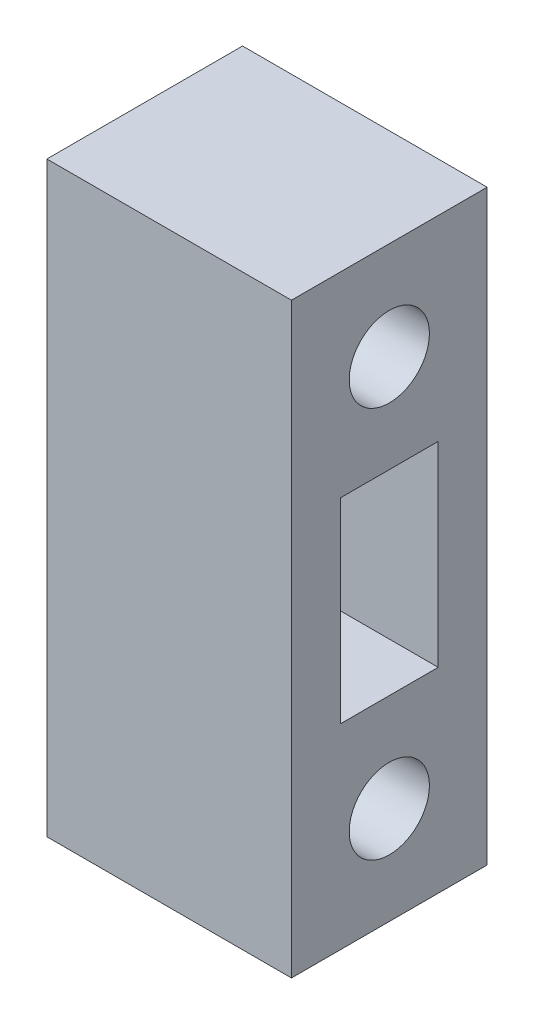
ISO-10303-21;
HEADER;
FILE_DESCRIPTION(('STEP AP214'),'2;1');
FILE_NAME('part.step','',(''),(''),'','','');
FILE_SCHEMA(('AUTOMOTIVE_DESIGN { 1 0 10303 214 1 1 1 1 }'));
ENDSEC;
DATA;
#1=APPLICATION_CONTEXT('core data for automotive mechanical design processes');
#2=APPLICATION_PROTOCOL_DEFINITION('international standard','automotive_design',2000,#1);
#3=PRODUCT_CONTEXT('',#1,'mechanical');
#4=PRODUCT('Part','Part','',(#3));
#5=PRODUCT_RELATED_PRODUCT_CATEGORY('part','',(#4));
#6=PRODUCT_DEFINITION_FORMATION('','',#4);
#7=PRODUCT_DEFINITION_CONTEXT('part definition',#1,'design');
#8=PRODUCT_DEFINITION('design','',#6,#7);
#9=PRODUCT_DEFINITION_SHAPE('','',#8);
#10=(LENGTH_UNIT() NAMED_UNIT(*) SI_UNIT(.MILLI.,.METRE.));
#11=(NAMED_UNIT(*) PLANE_ANGLE_UNIT() SI_UNIT($,.RADIAN.));
#12=(NAMED_UNIT(*) SI_UNIT($,.STERADIAN.) SOLID_ANGLE_UNIT());
#13=UNCERTAINTY_MEASURE_WITH_UNIT(LENGTH_MEASURE(1.E-05),#10,'distance_accuracy_value','');
#14=(GEOMETRIC_REPRESENTATION_CONTEXT(3) GLOBAL_UNCERTAINTY_ASSIGNED_CONTEXT((#13)) GLOBAL_UNIT_ASSIGNED_CONTEXT((#10,
#11,#12)) REPRESENTATION_CONTEXT('',''));
#15=CARTESIAN_POINT('',(0.,0.,0.));
#16=DIRECTION('',(0.,0.,1.));
#17=DIRECTION('',(1.,0.,0.));
#18=AXIS2_PLACEMENT_3D('',#15,#16,#17);
#19=CARTESIAN_POINT('',(25.,0.,0.));
#20=DIRECTION('',(-1.,0.,0.));
#21=DIRECTION('',(0.,0.,1.));
#22=AXIS2_PLACEMENT_3D('',#19,#20,#21);
#23=PLANE('',#22);
#24=CARTESIAN_POINT('',(25.,-20.,0.));
#25=DIRECTION('',(1.,0.,0.));
#26=DIRECTION('',(0.,0.,-1.));
#27=AXIS2_PLACEMENT_3D('',#24,#25,#26);
#28=CIRCLE('',#27,4.1);
#29=CARTESIAN_POINT('',(25.,-20.,-4.10000000000001));
#30=VERTEX_POINT('',#29);
#31=EDGE_CURVE('E134',#30,#30,#28,.T.);
#32=ORIENTED_EDGE('',*,*,#31,.F.);
#33=EDGE_LOOP('',(#32));
#34=FACE_BOUND('',#33,.T.);
#35=DIRECTION('',(0.,1.,0.));
#36=VECTOR('',#35,1.);
#37=CARTESIAN_POINT('',(25.,-30.,-10.));
#38=LINE('',#37,#36);
#39=CARTESIAN_POINT('',(25.,-30.,-10.));
#40=VERTEX_POINT('',#39);
#41=CARTESIAN_POINT('',(25.,30.,-10.));
#42=VERTEX_POINT('',#41);
#43=EDGE_CURVE('E146',#40,#42,#38,.T.);
#44=ORIENTED_EDGE('',*,*,#43,.T.);
#45=DIRECTION('',(0.,0.,1.));
#46=VECTOR('',#45,1.);
#47=CARTESIAN_POINT('',(25.,30.,10.));
#48=LINE('',#47,#46);
#49=CARTESIAN_POINT('',(25.,30.,10.));
#50=VERTEX_POINT('',#49);
#51=EDGE_CURVE('E149',#42,#50,#48,.T.);
#52=ORIENTED_EDGE('',*,*,#51,.T.);
#53=DIRECTION('',(0.,-1.,0.));
#54=VECTOR('',#53,1.);
#55=CARTESIAN_POINT('',(25.,-30.,10.));
#56=LINE('',#55,#54);
#57=CARTESIAN_POINT('',(25.,-30.,10.));
#58=VERTEX_POINT('',#57);
#59=EDGE_CURVE('E152',#50,#58,#56,.T.);
#60=ORIENTED_EDGE('',*,*,#59,.T.);
#61=DIRECTION('',(0.,0.,-1.));
#62=VECTOR('',#61,1.);
#63=CARTESIAN_POINT('',(25.,-30.,10.));
#64=LINE('',#63,#62);
#65=EDGE_CURVE('E154',#58,#40,#64,.T.);
#66=ORIENTED_EDGE('',*,*,#65,.T.);
#67=EDGE_LOOP('',(#44,#52,#60,#66));
#68=FACE_BOUND('',#67,.T.);
#69=CARTESIAN_POINT('',(25.,20.,0.));
#70=DIRECTION('',(1.,0.,0.));
#71=DIRECTION('',(0.,0.,-1.));
#72=AXIS2_PLACEMENT_3D('',#69,#70,#71);
#73=CIRCLE('',#72,4.1);
#74=CARTESIAN_POINT('',(25.,20.,-4.10000000000001));
#75=VERTEX_POINT('',#74);
#76=EDGE_CURVE('E140',#75,#75,#73,.T.);
#77=ORIENTED_EDGE('',*,*,#76,.F.);
#78=EDGE_LOOP('',(#77));
#79=FACE_BOUND('',#78,.T.);
#80=DIRECTION('',(0.,1.,0.));
#81=VECTOR('',#80,1.);
#82=CARTESIAN_POINT('',(25.,-10.,-5.));
#83=LINE('',#82,#81);
#84=CARTESIAN_POINT('',(25.,-10.,-5.));
#85=VERTEX_POINT('',#84);
#86=CARTESIAN_POINT('',(25.,10.,-5.));
#87=VERTEX_POINT('',#86);
#88=EDGE_CURVE('E98',#85,#87,#83,.T.);
#89=ORIENTED_EDGE('',*,*,#88,.F.);
#90=DIRECTION('',(0.,0.,-1.));
#91=VECTOR('',#90,1.);
#92=CARTESIAN_POINT('',(25.,-10.,5.));
#93=LINE('',#92,#91);
#94=CARTESIAN_POINT('',(25.,-10.,5.));
#95=VERTEX_POINT('',#94);
#96=EDGE_CURVE('E120',#95,#85,#93,.T.);
#97=ORIENTED_EDGE('',*,*,#96,.F.);
#98=DIRECTION('',(0.,-1.,0.));
#99=VECTOR('',#98,1.);
#100=CARTESIAN_POINT('',(25.,-10.,5.));
#101=LINE('',#100,#99);
#102=CARTESIAN_POINT('',(25.,10.,5.));
#103=VERTEX_POINT('',#102);
#104=EDGE_CURVE('E118',#103,#95,#101,.T.);
#105=ORIENTED_EDGE('',*,*,#104,.F.);
#106=DIRECTION('',(0.,0.,1.));
#107=VECTOR('',#106,1.);
#108=CARTESIAN_POINT('',(25.,10.,5.));
#109=LINE('',#108,#107);
#110=EDGE_CURVE('E106',#87,#103,#109,.T.);
#111=ORIENTED_EDGE('',*,*,#110,.F.);
#112=EDGE_LOOP('',(#89,#97,#105,#111));
#113=FACE_BOUND('',#112,.T.);
#114=ADVANCED_FACE('F33',(#34,#68,#79,#113),#23,.F.);
#115=CARTESIAN_POINT('',(0.,0.,0.));
#116=DIRECTION('',(-1.,0.,0.));
#117=DIRECTION('',(0.,0.,1.));
#118=AXIS2_PLACEMENT_3D('',#115,#116,#117);
#119=PLANE('',#118);
#120=CARTESIAN_POINT('',(0.,-20.,0.));
#121=DIRECTION('',(1.,0.,0.));
#122=DIRECTION('',(0.,0.,-1.));
#123=AXIS2_PLACEMENT_3D('',#120,#121,#122);
#124=CIRCLE('',#123,4.1);
#125=CARTESIAN_POINT('',(0.,-20.,-4.10000000000001));
#126=VERTEX_POINT('',#125);
#127=EDGE_CURVE('E114',#126,#126,#124,.T.);
#128=ORIENTED_EDGE('',*,*,#127,.T.);
#129=EDGE_LOOP('',(#128));
#130=FACE_BOUND('',#129,.T.);
#131=DIRECTION('',(0.,1.,0.));
#132=VECTOR('',#131,1.);
#133=CARTESIAN_POINT('',(0.,-30.,-10.));
#134=LINE('',#133,#132);
#135=CARTESIAN_POINT('',(0.,-30.,-10.));
#136=VERTEX_POINT('',#135);
#137=CARTESIAN_POINT('',(0.,30.,-10.));
#138=VERTEX_POINT('',#137);
#139=EDGE_CURVE('E143',#136,#138,#134,.T.);
#140=ORIENTED_EDGE('',*,*,#139,.F.);
#141=DIRECTION('',(0.,0.,-1.));
#142=VECTOR('',#141,1.);
#143=CARTESIAN_POINT('',(0.,-30.,10.));
#144=LINE('',#143,#142);
#145=CARTESIAN_POINT('',(0.,-30.,10.));
#146=VERTEX_POINT('',#145);
#147=EDGE_CURVE('E150',#146,#136,#144,.T.);
#148=ORIENTED_EDGE('',*,*,#147,.F.);
#149=DIRECTION('',(0.,-1.,0.));
#150=VECTOR('',#149,1.);
#151=CARTESIAN_POINT('',(0.,-30.,10.));
#152=LINE('',#151,#150);
#153=CARTESIAN_POINT('',(0.,30.,10.));
#154=VERTEX_POINT('',#153);
#155=EDGE_CURVE('E161',#154,#146,#152,.T.);
#156=ORIENTED_EDGE('',*,*,#155,.F.);
#157=DIRECTION('',(0.,0.,1.));
#158=VECTOR('',#157,1.);
#159=CARTESIAN_POINT('',(0.,30.,10.));
#160=LINE('',#159,#158);
#161=EDGE_CURVE('E159',#138,#154,#160,.T.);
#162=ORIENTED_EDGE('',*,*,#161,.F.);
#163=EDGE_LOOP('',(#140,#148,#156,#162));
#164=FACE_BOUND('',#163,.T.);
#165=CARTESIAN_POINT('',(0.,20.,0.));
#166=DIRECTION('',(1.,0.,0.));
#167=DIRECTION('',(0.,0.,-1.));
#168=AXIS2_PLACEMENT_3D('',#165,#166,#167);
#169=CIRCLE('',#168,4.1);
#170=CARTESIAN_POINT('',(0.,20.,-4.10000000000001));
#171=VERTEX_POINT('',#170);
#172=EDGE_CURVE('E137',#171,#171,#169,.T.);
#173=ORIENTED_EDGE('',*,*,#172,.T.);
#174=EDGE_LOOP('',(#173));
#175=FACE_BOUND('',#174,.T.);
#176=DIRECTION('',(0.,0.,-1.));
#177=VECTOR('',#176,1.);
#178=CARTESIAN_POINT('',(0.,-10.,5.));
#179=LINE('',#178,#177);
#180=CARTESIAN_POINT('',(0.,-10.,5.));
#181=VERTEX_POINT('',#180);
#182=CARTESIAN_POINT('',(0.,-10.,-5.));
#183=VERTEX_POINT('',#182);
#184=EDGE_CURVE('E107',#181,#183,#179,.T.);
#185=ORIENTED_EDGE('',*,*,#184,.T.);
#186=DIRECTION('',(0.,1.,0.));
#187=VECTOR('',#186,1.);
#188=CARTESIAN_POINT('',(0.,-10.,-5.));
#189=LINE('',#188,#187);
#190=CARTESIAN_POINT('',(0.,10.,-5.));
#191=VERTEX_POINT('',#190);
#192=EDGE_CURVE('E56',#183,#191,#189,.T.);
#193=ORIENTED_EDGE('',*,*,#192,.T.);
#194=DIRECTION('',(0.,0.,1.));
#195=VECTOR('',#194,1.);
#196=CARTESIAN_POINT('',(0.,10.,5.));
#197=LINE('',#196,#195);
#198=CARTESIAN_POINT('',(0.,10.,5.));
#199=VERTEX_POINT('',#198);
#200=EDGE_CURVE('E113',#191,#199,#197,.T.);
#201=ORIENTED_EDGE('',*,*,#200,.T.);
#202=DIRECTION('',(0.,-1.,0.));
#203=VECTOR('',#202,1.);
#204=CARTESIAN_POINT('',(0.,-10.,5.));
#205=LINE('',#204,#203);
#206=EDGE_CURVE('E126',#199,#181,#205,.T.);
#207=ORIENTED_EDGE('',*,*,#206,.T.);
#208=EDGE_LOOP('',(#185,#193,#201,#207));
#209=FACE_BOUND('',#208,.T.);
#210=ADVANCED_FACE('F179',(#130,#164,#175,#209),#119,.T.);
#211=CARTESIAN_POINT('',(25.,-30.,-10.));
#212=DIRECTION('',(0.,0.,1.));
#213=DIRECTION('',(1.,0.,0.));
#214=AXIS2_PLACEMENT_3D('',#211,#212,#213);
#215=PLANE('',#214);
#216=ORIENTED_EDGE('',*,*,#139,.T.);
#217=DIRECTION('',(-1.,0.,0.));
#218=VECTOR('',#217,1.);
#219=CARTESIAN_POINT('',(25.,30.,-10.));
#220=LINE('',#219,#218);
#221=EDGE_CURVE('E11',#42,#138,#220,.T.);
#222=ORIENTED_EDGE('',*,*,#221,.F.);
#223=ORIENTED_EDGE('',*,*,#43,.F.);
#224=DIRECTION('',(-1.,0.,0.));
#225=VECTOR('',#224,1.);
#226=CARTESIAN_POINT('',(25.,-30.,-10.));
#227=LINE('',#226,#225);
#228=EDGE_CURVE('E156',#40,#136,#227,.T.);
#229=ORIENTED_EDGE('',*,*,#228,.T.);
#230=EDGE_LOOP('',(#216,#222,#223,#229));
#231=FACE_BOUND('',#230,.T.);
#232=ADVANCED_FACE('F35',(#231),#215,.F.);
#233=CARTESIAN_POINT('',(25.,30.,10.));
#234=DIRECTION('',(0.,-1.,0.));
#235=DIRECTION('',(0.,0.,-1.));
#236=AXIS2_PLACEMENT_3D('',#233,#234,#235);
#237=PLANE('',#236);
#238=ORIENTED_EDGE('',*,*,#161,.T.);
#239=DIRECTION('',(-1.,0.,0.));
#240=VECTOR('',#239,1.);
#241=CARTESIAN_POINT('',(25.,30.,10.));
#242=LINE('',#241,#240);
#243=EDGE_CURVE('E41',#50,#154,#242,.T.);
#244=ORIENTED_EDGE('',*,*,#243,.F.);
#245=ORIENTED_EDGE('',*,*,#51,.F.);
#246=ORIENTED_EDGE('',*,*,#221,.T.);
#247=EDGE_LOOP('',(#238,#244,#245,#246));
#248=FACE_BOUND('',#247,.T.);
#249=ADVANCED_FACE('F190',(#248),#237,.F.);
#250=CARTESIAN_POINT('',(25.,-30.,10.));
#251=DIRECTION('',(0.,0.,-1.));
#252=DIRECTION('',(-1.,0.,0.));
#253=AXIS2_PLACEMENT_3D('',#250,#251,#252);
#254=PLANE('',#253);
#255=ORIENTED_EDGE('',*,*,#155,.T.);
#256=DIRECTION('',(-1.,0.,0.));
#257=VECTOR('',#256,1.);
#258=CARTESIAN_POINT('',(25.,-30.,10.));
#259=LINE('',#258,#257);
#260=EDGE_CURVE('E166',#58,#146,#259,.T.);
#261=ORIENTED_EDGE('',*,*,#260,.F.);
#262=ORIENTED_EDGE('',*,*,#59,.F.);
#263=ORIENTED_EDGE('',*,*,#243,.T.);
#264=EDGE_LOOP('',(#255,#261,#262,#263));
#265=FACE_BOUND('',#264,.T.);
#266=ADVANCED_FACE('F173',(#265),#254,.F.);
#267=CARTESIAN_POINT('',(25.,-30.,10.));
#268=DIRECTION('',(0.,1.,0.));
#269=DIRECTION('',(0.,0.,1.));
#270=AXIS2_PLACEMENT_3D('',#267,#268,#269);
#271=PLANE('',#270);
#272=ORIENTED_EDGE('',*,*,#147,.T.);
#273=ORIENTED_EDGE('',*,*,#228,.F.);
#274=ORIENTED_EDGE('',*,*,#65,.F.);
#275=ORIENTED_EDGE('',*,*,#260,.T.);
#276=EDGE_LOOP('',(#272,#273,#274,#275));
#277=FACE_BOUND('',#276,.T.);
#278=ADVANCED_FACE('F183',(#277),#271,.F.);
#279=CARTESIAN_POINT('',(25.,20.,0.));
#280=DIRECTION('',(-1.,0.,0.));
#281=DIRECTION('',(0.,0.,1.));
#282=AXIS2_PLACEMENT_3D('',#279,#280,#281);
#283=CYLINDRICAL_SURFACE('',#282,4.1);
#284=ORIENTED_EDGE('',*,*,#76,.T.);
#285=EDGE_LOOP('',(#284));
#286=FACE_BOUND('',#285,.T.);
#287=ORIENTED_EDGE('',*,*,#172,.F.);
#288=EDGE_LOOP('',(#287));
#289=FACE_BOUND('',#288,.T.);
#290=ADVANCED_FACE('F207',(#286,#289),#283,.F.);
#291=CARTESIAN_POINT('',(25.,-20.,0.));
#292=DIRECTION('',(-1.,0.,0.));
#293=DIRECTION('',(0.,0.,1.));
#294=AXIS2_PLACEMENT_3D('',#291,#292,#293);
#295=CYLINDRICAL_SURFACE('',#294,4.1);
#296=ORIENTED_EDGE('',*,*,#31,.T.);
#297=EDGE_LOOP('',(#296));
#298=FACE_BOUND('',#297,.T.);
#299=ORIENTED_EDGE('',*,*,#127,.F.);
#300=EDGE_LOOP('',(#299));
#301=FACE_BOUND('',#300,.T.);
#302=ADVANCED_FACE('F214',(#298,#301),#295,.F.);
#303=CARTESIAN_POINT('',(25.,-10.,-5.));
#304=DIRECTION('',(0.,0.,1.));
#305=DIRECTION('',(1.,0.,0.));
#306=AXIS2_PLACEMENT_3D('',#303,#304,#305);
#307=PLANE('',#306);
#308=ORIENTED_EDGE('',*,*,#192,.F.);
#309=DIRECTION('',(-1.,0.,0.));
#310=VECTOR('',#309,1.);
#311=CARTESIAN_POINT('',(25.,-10.,-5.));
#312=LINE('',#311,#310);
#313=EDGE_CURVE('E102',#85,#183,#312,.T.);
#314=ORIENTED_EDGE('',*,*,#313,.F.);
#315=ORIENTED_EDGE('',*,*,#88,.T.);
#316=DIRECTION('',(-1.,0.,0.));
#317=VECTOR('',#316,1.);
#318=CARTESIAN_POINT('',(25.,10.,-5.));
#319=LINE('',#318,#317);
#320=EDGE_CURVE('E101',#87,#191,#319,.T.);
#321=ORIENTED_EDGE('',*,*,#320,.T.);
#322=EDGE_LOOP('',(#308,#314,#315,#321));
#323=FACE_BOUND('',#322,.T.);
#324=ADVANCED_FACE('F100',(#323),#307,.T.);
#325=CARTESIAN_POINT('',(25.,10.,5.));
#326=DIRECTION('',(0.,-1.,0.));
#327=DIRECTION('',(0.,0.,-1.));
#328=AXIS2_PLACEMENT_3D('',#325,#326,#327);
#329=PLANE('',#328);
#330=ORIENTED_EDGE('',*,*,#200,.F.);
#331=ORIENTED_EDGE('',*,*,#320,.F.);
#332=ORIENTED_EDGE('',*,*,#110,.T.);
#333=DIRECTION('',(-1.,0.,0.));
#334=VECTOR('',#333,1.);
#335=CARTESIAN_POINT('',(25.,10.,5.));
#336=LINE('',#335,#334);
#337=EDGE_CURVE('E115',#103,#199,#336,.T.);
#338=ORIENTED_EDGE('',*,*,#337,.T.);
#339=EDGE_LOOP('',(#330,#331,#332,#338));
#340=FACE_BOUND('',#339,.T.);
#341=ADVANCED_FACE('F110',(#340),#329,.T.);
#342=CARTESIAN_POINT('',(25.,-10.,5.));
#343=DIRECTION('',(0.,0.,-1.));
#344=DIRECTION('',(-1.,0.,0.));
#345=AXIS2_PLACEMENT_3D('',#342,#343,#344);
#346=PLANE('',#345);
#347=ORIENTED_EDGE('',*,*,#206,.F.);
#348=ORIENTED_EDGE('',*,*,#337,.F.);
#349=ORIENTED_EDGE('',*,*,#104,.T.);
#350=DIRECTION('',(-1.,0.,0.));
#351=VECTOR('',#350,1.);
#352=CARTESIAN_POINT('',(25.,-10.,5.));
#353=LINE('',#352,#351);
#354=EDGE_CURVE('E48',#95,#181,#353,.T.);
#355=ORIENTED_EDGE('',*,*,#354,.T.);
#356=EDGE_LOOP('',(#347,#348,#349,#355));
#357=FACE_BOUND('',#356,.T.);
#358=ADVANCED_FACE('F227',(#357),#346,.T.);
#359=CARTESIAN_POINT('',(25.,-10.,5.));
#360=DIRECTION('',(0.,1.,0.));
#361=DIRECTION('',(0.,0.,1.));
#362=AXIS2_PLACEMENT_3D('',#359,#360,#361);
#363=PLANE('',#362);
#364=ORIENTED_EDGE('',*,*,#184,.F.);
#365=ORIENTED_EDGE('',*,*,#354,.F.);
#366=ORIENTED_EDGE('',*,*,#96,.T.);
#367=ORIENTED_EDGE('',*,*,#313,.T.);
#368=EDGE_LOOP('',(#364,#365,#366,#367));
#369=FACE_BOUND('',#368,.T.);
#370=ADVANCED_FACE('F225',(#369),#363,.T.);
#371=CLOSED_SHELL('',(#114,#210,#232,#249,#266,#278,#290,#302,#324,#341,#358,#370));
#372=MANIFOLD_SOLID_BREP('B2',#371);
#373=ADVANCED_BREP_SHAPE_REPRESENTATION('',(#18,#372),#14);
#374=SHAPE_DEFINITION_REPRESENTATION(#9,#373);
ENDSEC;
END-ISO-10303-21;
